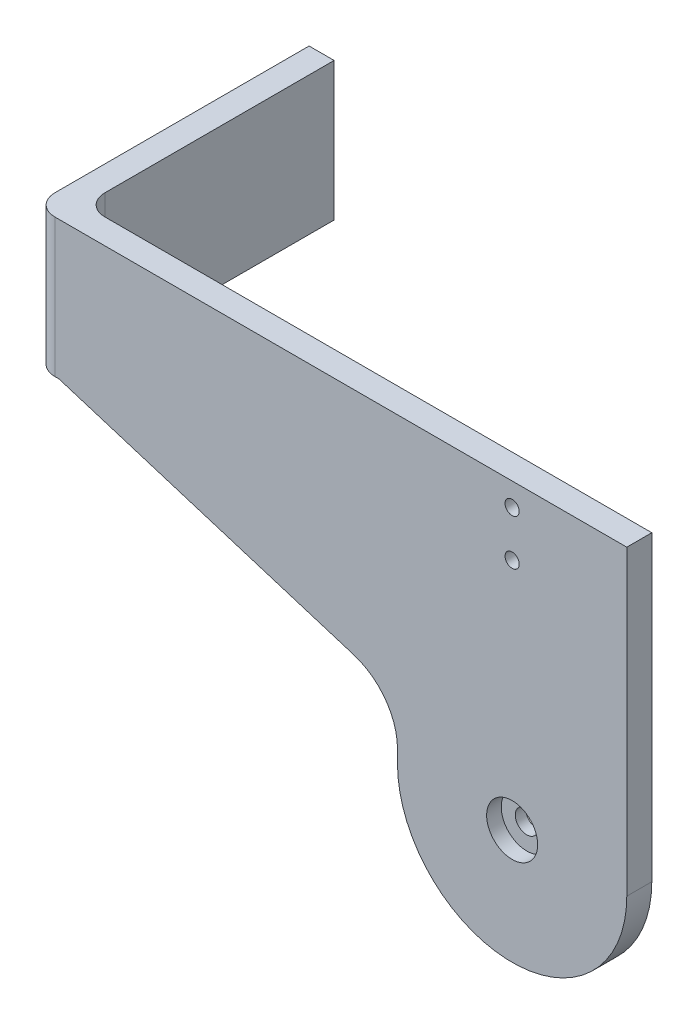
ISO-10303-21;
HEADER;
FILE_DESCRIPTION(('STEP AP214'),'2;1');
FILE_NAME('part.step','',(''),(''),'','','');
FILE_SCHEMA(('AUTOMOTIVE_DESIGN { 1 0 10303 214 1 1 1 1 }'));
ENDSEC;
DATA;
#1=APPLICATION_CONTEXT('core data for automotive mechanical design processes');
#2=APPLICATION_PROTOCOL_DEFINITION('international standard','automotive_design',2000,#1);
#3=PRODUCT_CONTEXT('',#1,'mechanical');
#4=PRODUCT('Part','Part','',(#3));
#5=PRODUCT_RELATED_PRODUCT_CATEGORY('part','',(#4));
#6=PRODUCT_DEFINITION_FORMATION('','',#4);
#7=PRODUCT_DEFINITION_CONTEXT('part definition',#1,'design');
#8=PRODUCT_DEFINITION('design','',#6,#7);
#9=PRODUCT_DEFINITION_SHAPE('','',#8);
#10=(LENGTH_UNIT() NAMED_UNIT(*) SI_UNIT(.MILLI.,.METRE.));
#11=(NAMED_UNIT(*) PLANE_ANGLE_UNIT() SI_UNIT($,.RADIAN.));
#12=(NAMED_UNIT(*) SI_UNIT($,.STERADIAN.) SOLID_ANGLE_UNIT());
#13=UNCERTAINTY_MEASURE_WITH_UNIT(LENGTH_MEASURE(1.E-05),#10,'distance_accuracy_value','');
#14=(GEOMETRIC_REPRESENTATION_CONTEXT(3) GLOBAL_UNCERTAINTY_ASSIGNED_CONTEXT((#13)) GLOBAL_UNIT_ASSIGNED_CONTEXT((#10,
#11,#12)) REPRESENTATION_CONTEXT('',''));
#15=CARTESIAN_POINT('',(0.,0.,0.));
#16=DIRECTION('',(0.,0.,1.));
#17=DIRECTION('',(1.,0.,0.));
#18=AXIS2_PLACEMENT_3D('',#15,#16,#17);
#19=CARTESIAN_POINT('',(-103.7,0.,-5.));
#20=DIRECTION('',(0.,-1.,0.));
#21=DIRECTION('',(0.,0.,-1.));
#22=AXIS2_PLACEMENT_3D('',#19,#20,#21);
#23=CYLINDRICAL_SURFACE('',#22,5.);
#24=DIRECTION('',(0.,1.,0.));
#25=VECTOR('',#24,1.);
#26=CARTESIAN_POINT('',(-103.7,0.,0.));
#27=LINE('',#26,#25);
#28=CARTESIAN_POINT('',(-103.7,37.7951910226967,0.));
#29=VERTEX_POINT('',#28);
#30=CARTESIAN_POINT('',(-103.7,72.5,0.));
#31=VERTEX_POINT('',#30);
#32=EDGE_CURVE('E212',#29,#31,#27,.T.);
#33=ORIENTED_EDGE('',*,*,#32,.F.);
#34=CARTESIAN_POINT('',(-103.7,37.7951910226967,-5.));
#35=DIRECTION('',(0.296450533397002,0.955048208861015,0.));
#36=DIRECTION('',(0.955048208861015,-0.296450533397003,0.));
#37=AXIS2_PLACEMENT_3D('',#34,#35,#36);
#38=ELLIPSE('',#37,5.2353378118608,5.);
#39=CARTESIAN_POINT('',(-108.7,39.3472097095363,-5.));
#40=VERTEX_POINT('',#39);
#41=EDGE_CURVE('E217',#29,#40,#38,.F.);
#42=ORIENTED_EDGE('',*,*,#41,.T.);
#43=DIRECTION('',(0.,1.,0.));
#44=VECTOR('',#43,1.);
#45=CARTESIAN_POINT('',(-108.7,0.,-5.));
#46=LINE('',#45,#44);
#47=CARTESIAN_POINT('',(-108.7,72.5,-5.));
#48=VERTEX_POINT('',#47);
#49=EDGE_CURVE('E215',#48,#40,#46,.F.);
#50=ORIENTED_EDGE('',*,*,#49,.F.);
#51=CARTESIAN_POINT('',(-103.7,72.5,-5.));
#52=DIRECTION('',(0.,-1.,0.));
#53=DIRECTION('',(1.,0.,0.));
#54=AXIS2_PLACEMENT_3D('',#51,#52,#53);
#55=CIRCLE('',#54,5.);
#56=EDGE_CURVE('E126',#48,#31,#55,.F.);
#57=ORIENTED_EDGE('',*,*,#56,.T.);
#58=EDGE_LOOP('',(#33,#42,#50,#57));
#59=FACE_BOUND('',#58,.T.);
#60=ADVANCED_FACE('F36',(#59),#23,.F.);
#61=CARTESIAN_POINT('',(-42.5,3.09246886019721,0.));
#62=DIRECTION('',(0.,0.,-1.));
#63=DIRECTION('',(-1.,0.,0.));
#64=AXIS2_PLACEMENT_3D('',#61,#62,#63);
#65=CYLINDRICAL_SURFACE('',#64,15.);
#66=DIRECTION('',(0.,0.,1.));
#67=VECTOR('',#66,1.);
#68=CARTESIAN_POINT('',(-38.053241999045,17.4181919931124,0.));
#69=LINE('',#68,#67);
#70=CARTESIAN_POINT('',(-38.053241999045,17.4181919931124,0.));
#71=VERTEX_POINT('',#70);
#72=CARTESIAN_POINT('',(-38.053241999045,17.4181919931124,6.));
#73=VERTEX_POINT('',#72);
#74=EDGE_CURVE('E202',#71,#73,#69,.T.);
#75=ORIENTED_EDGE('',*,*,#74,.F.);
#76=CARTESIAN_POINT('',(-42.5,3.09246886019721,0.));
#77=DIRECTION('',(0.,0.,1.));
#78=DIRECTION('',(1.,0.,0.));
#79=AXIS2_PLACEMENT_3D('',#76,#77,#78);
#80=CIRCLE('',#79,15.);
#81=CARTESIAN_POINT('',(-27.5,3.09246886019721,0.));
#82=VERTEX_POINT('',#81);
#83=EDGE_CURVE('E208',#71,#82,#80,.F.);
#84=ORIENTED_EDGE('',*,*,#83,.T.);
#85=DIRECTION('',(0.,0.,1.));
#86=VECTOR('',#85,1.);
#87=CARTESIAN_POINT('',(-27.5,3.09246886019721,0.));
#88=LINE('',#87,#86);
#89=CARTESIAN_POINT('',(-27.5,3.09246886019721,6.));
#90=VERTEX_POINT('',#89);
#91=EDGE_CURVE('E205',#90,#82,#88,.F.);
#92=ORIENTED_EDGE('',*,*,#91,.F.);
#93=CARTESIAN_POINT('',(-42.5,3.09246886019721,6.));
#94=DIRECTION('',(0.,0.,1.));
#95=DIRECTION('',(1.,0.,0.));
#96=AXIS2_PLACEMENT_3D('',#93,#94,#95);
#97=CIRCLE('',#96,15.);
#98=EDGE_CURVE('E210',#90,#73,#97,.T.);
#99=ORIENTED_EDGE('',*,*,#98,.T.);
#100=EDGE_LOOP('',(#75,#84,#92,#99));
#101=FACE_BOUND('',#100,.T.);
#102=ADVANCED_FACE('F245',(#101),#65,.F.);
#103=CARTESIAN_POINT('',(0.,0.,6.));
#104=DIRECTION('',(0.,0.,-1.));
#105=DIRECTION('',(-1.,0.,0.));
#106=AXIS2_PLACEMENT_3D('',#103,#104,#105);
#107=CYLINDRICAL_SURFACE('',#106,27.5);
#108=CARTESIAN_POINT('',(0.,0.,0.));
#109=DIRECTION('',(0.,0.,1.));
#110=DIRECTION('',(1.,0.,0.));
#111=AXIS2_PLACEMENT_3D('',#108,#109,#110);
#112=CIRCLE('',#111,27.5);
#113=CARTESIAN_POINT('',(-27.5,0.,0.));
#114=VERTEX_POINT('',#113);
#115=CARTESIAN_POINT('',(27.5,0.,0.));
#116=VERTEX_POINT('',#115);
#117=EDGE_CURVE('E185',#114,#116,#112,.T.);
#118=ORIENTED_EDGE('',*,*,#117,.T.);
#119=DIRECTION('',(0.,0.,-1.));
#120=VECTOR('',#119,1.);
#121=CARTESIAN_POINT('',(27.5,0.,6.));
#122=LINE('',#121,#120);
#123=CARTESIAN_POINT('',(27.5,0.,6.));
#124=VERTEX_POINT('',#123);
#125=EDGE_CURVE('E199',#124,#116,#122,.T.);
#126=ORIENTED_EDGE('',*,*,#125,.F.);
#127=CARTESIAN_POINT('',(0.,0.,6.));
#128=DIRECTION('',(0.,0.,1.));
#129=DIRECTION('',(1.,0.,0.));
#130=AXIS2_PLACEMENT_3D('',#127,#128,#129);
#131=CIRCLE('',#130,27.5);
#132=CARTESIAN_POINT('',(-27.5,0.,6.));
#133=VERTEX_POINT('',#132);
#134=EDGE_CURVE('E186',#133,#124,#131,.T.);
#135=ORIENTED_EDGE('',*,*,#134,.F.);
#136=DIRECTION('',(0.,0.,-1.));
#137=VECTOR('',#136,1.);
#138=CARTESIAN_POINT('',(-27.5,0.,6.));
#139=LINE('',#138,#137);
#140=EDGE_CURVE('E192',#133,#114,#139,.T.);
#141=ORIENTED_EDGE('',*,*,#140,.T.);
#142=EDGE_LOOP('',(#118,#126,#135,#141));
#143=FACE_BOUND('',#142,.T.);
#144=ADVANCED_FACE('F250',(#143),#107,.T.);
#145=CARTESIAN_POINT('',(27.5,0.,6.));
#146=DIRECTION('',(-1.,0.,0.));
#147=DIRECTION('',(0.,0.,1.));
#148=AXIS2_PLACEMENT_3D('',#145,#146,#147);
#149=PLANE('',#148);
#150=DIRECTION('',(0.,1.,0.));
#151=VECTOR('',#150,1.);
#152=CARTESIAN_POINT('',(27.5,0.,0.));
#153=LINE('',#152,#151);
#154=CARTESIAN_POINT('',(27.5,72.5,0.));
#155=VERTEX_POINT('',#154);
#156=EDGE_CURVE('E190',#116,#155,#153,.T.);
#157=ORIENTED_EDGE('',*,*,#156,.T.);
#158=DIRECTION('',(0.,0.,-1.));
#159=VECTOR('',#158,1.);
#160=CARTESIAN_POINT('',(27.5,72.5,6.));
#161=LINE('',#160,#159);
#162=CARTESIAN_POINT('',(27.5,72.5,6.));
#163=VERTEX_POINT('',#162);
#164=EDGE_CURVE('E181',#163,#155,#161,.T.);
#165=ORIENTED_EDGE('',*,*,#164,.F.);
#166=DIRECTION('',(0.,1.,0.));
#167=VECTOR('',#166,1.);
#168=CARTESIAN_POINT('',(27.5,0.,6.));
#169=LINE('',#168,#167);
#170=EDGE_CURVE('E189',#124,#163,#169,.T.);
#171=ORIENTED_EDGE('',*,*,#170,.F.);
#172=ORIENTED_EDGE('',*,*,#125,.T.);
#173=EDGE_LOOP('',(#157,#165,#171,#172));
#174=FACE_BOUND('',#173,.T.);
#175=ADVANCED_FACE('F254',(#174),#149,.F.);
#176=CARTESIAN_POINT('',(0.,0.,6.));
#177=DIRECTION('',(0.,0.,1.));
#178=DIRECTION('',(1.,0.,0.));
#179=AXIS2_PLACEMENT_3D('',#176,#177,#178);
#180=PLANE('',#179);
#181=CARTESIAN_POINT('',(0.,0.,6.));
#182=DIRECTION('',(0.,0.,1.));
#183=DIRECTION('',(1.,0.,0.));
#184=AXIS2_PLACEMENT_3D('',#181,#182,#183);
#185=CIRCLE('',#184,6.119);
#186=CARTESIAN_POINT('',(6.119,0.,6.));
#187=VERTEX_POINT('',#186);
#188=EDGE_CURVE('E499',#187,#187,#185,.T.);
#189=ORIENTED_EDGE('',*,*,#188,.F.);
#190=EDGE_LOOP('',(#189));
#191=FACE_BOUND('',#190,.T.);
#192=CARTESIAN_POINT('',(0.,67.,6.));
#193=DIRECTION('',(0.,0.,-1.));
#194=DIRECTION('',(-1.,0.,0.));
#195=AXIS2_PLACEMENT_3D('',#192,#193,#194);
#196=CIRCLE('',#195,1.7);
#197=CARTESIAN_POINT('',(-1.7,67.,6.));
#198=VERTEX_POINT('',#197);
#199=EDGE_CURVE('E518',#198,#198,#196,.T.);
#200=ORIENTED_EDGE('',*,*,#199,.T.);
#201=EDGE_LOOP('',(#200));
#202=FACE_BOUND('',#201,.T.);
#203=CARTESIAN_POINT('',(0.,56.05,6.));
#204=DIRECTION('',(0.,0.,-1.));
#205=DIRECTION('',(-1.,0.,0.));
#206=AXIS2_PLACEMENT_3D('',#203,#204,#205);
#207=CIRCLE('',#206,1.7);
#208=CARTESIAN_POINT('',(-1.7,56.05,6.));
#209=VERTEX_POINT('',#208);
#210=EDGE_CURVE('E147',#209,#209,#207,.T.);
#211=ORIENTED_EDGE('',*,*,#210,.T.);
#212=EDGE_LOOP('',(#211));
#213=FACE_BOUND('',#212,.T.);
#214=DIRECTION('',(-1.,0.,0.));
#215=VECTOR('',#214,1.);
#216=CARTESIAN_POINT('',(27.5,72.5,6.));
#217=LINE('',#216,#215);
#218=CARTESIAN_POINT('',(-109.7,72.5,6.));
#219=VERTEX_POINT('',#218);
#220=EDGE_CURVE('E178',#163,#219,#217,.T.);
#221=ORIENTED_EDGE('',*,*,#220,.T.);
#222=DIRECTION('',(0.,-1.,0.));
#223=VECTOR('',#222,1.);
#224=CARTESIAN_POINT('',(-109.7,39.3472097095363,6.));
#225=LINE('',#224,#223);
#226=CARTESIAN_POINT('',(-109.7,39.3472097095363,6.));
#227=VERTEX_POINT('',#226);
#228=EDGE_CURVE('E221',#219,#227,#225,.T.);
#229=ORIENTED_EDGE('',*,*,#228,.T.);
#230=DIRECTION('',(1.,0.,0.));
#231=VECTOR('',#230,1.);
#232=CARTESIAN_POINT('',(-108.7,39.3472097095363,6.));
#233=LINE('',#232,#231);
#234=CARTESIAN_POINT('',(-108.7,39.3472097095363,6.));
#235=VERTEX_POINT('',#234);
#236=EDGE_CURVE('E157',#227,#235,#233,.T.);
#237=ORIENTED_EDGE('',*,*,#236,.T.);
#238=DIRECTION('',(-0.955048208861015,0.296450533397002,0.));
#239=VECTOR('',#238,1.);
#240=CARTESIAN_POINT('',(-108.7,39.3472097095363,6.));
#241=LINE('',#240,#239);
#242=EDGE_CURVE('E131',#73,#235,#241,.T.);
#243=ORIENTED_EDGE('',*,*,#242,.F.);
#244=ORIENTED_EDGE('',*,*,#98,.F.);
#245=DIRECTION('',(0.,1.,0.));
#246=VECTOR('',#245,1.);
#247=CARTESIAN_POINT('',(-27.5,14.1424262352607,6.));
#248=LINE('',#247,#246);
#249=EDGE_CURVE('E167',#133,#90,#248,.T.);
#250=ORIENTED_EDGE('',*,*,#249,.F.);
#251=ORIENTED_EDGE('',*,*,#134,.T.);
#252=ORIENTED_EDGE('',*,*,#170,.T.);
#253=EDGE_LOOP('',(#221,#229,#237,#243,#244,#250,#251,#252));
#254=FACE_BOUND('',#253,.T.);
#255=ADVANCED_FACE('F227',(#191,#202,#213,#254),#180,.T.);
#256=CARTESIAN_POINT('',(0.,0.,0.));
#257=DIRECTION('',(0.,0.,1.));
#258=DIRECTION('',(1.,0.,0.));
#259=AXIS2_PLACEMENT_3D('',#256,#257,#258);
#260=PLANE('',#259);
#261=CARTESIAN_POINT('',(0.,0.,0.));
#262=DIRECTION('',(0.,0.,1.));
#263=DIRECTION('',(1.,0.,0.));
#264=AXIS2_PLACEMENT_3D('',#261,#262,#263);
#265=CIRCLE('',#264,2.74999999999999);
#266=CARTESIAN_POINT('',(2.74999999999999,0.,0.));
#267=VERTEX_POINT('',#266);
#268=EDGE_CURVE('E40',#267,#267,#265,.T.);
#269=ORIENTED_EDGE('',*,*,#268,.T.);
#270=EDGE_LOOP('',(#269));
#271=FACE_BOUND('',#270,.T.);
#272=CARTESIAN_POINT('',(0.,67.,0.));
#273=DIRECTION('',(0.,0.,-1.));
#274=DIRECTION('',(-1.,0.,0.));
#275=AXIS2_PLACEMENT_3D('',#272,#273,#274);
#276=CIRCLE('',#275,4.525);
#277=CARTESIAN_POINT('',(-4.525,67.,0.));
#278=VERTEX_POINT('',#277);
#279=EDGE_CURVE('E506',#278,#278,#276,.T.);
#280=ORIENTED_EDGE('',*,*,#279,.F.);
#281=EDGE_LOOP('',(#280));
#282=FACE_BOUND('',#281,.T.);
#283=CARTESIAN_POINT('',(0.,56.05,0.));
#284=DIRECTION('',(0.,0.,-1.));
#285=DIRECTION('',(-1.,0.,0.));
#286=AXIS2_PLACEMENT_3D('',#283,#284,#285);
#287=CIRCLE('',#286,4.525);
#288=CARTESIAN_POINT('',(-4.525,56.05,0.));
#289=VERTEX_POINT('',#288);
#290=EDGE_CURVE('E521',#289,#289,#287,.T.);
#291=ORIENTED_EDGE('',*,*,#290,.F.);
#292=EDGE_LOOP('',(#291));
#293=FACE_BOUND('',#292,.T.);
#294=DIRECTION('',(-0.955048208861015,0.296450533397002,0.));
#295=VECTOR('',#294,1.);
#296=CARTESIAN_POINT('',(-108.7,39.3472097095363,0.));
#297=LINE('',#296,#295);
#298=EDGE_CURVE('E163',#71,#29,#297,.T.);
#299=ORIENTED_EDGE('',*,*,#298,.T.);
#300=ORIENTED_EDGE('',*,*,#32,.T.);
#301=DIRECTION('',(-1.,0.,0.));
#302=VECTOR('',#301,1.);
#303=CARTESIAN_POINT('',(27.5,72.5,0.));
#304=LINE('',#303,#302);
#305=EDGE_CURVE('E177',#155,#31,#304,.T.);
#306=ORIENTED_EDGE('',*,*,#305,.F.);
#307=ORIENTED_EDGE('',*,*,#156,.F.);
#308=ORIENTED_EDGE('',*,*,#117,.F.);
#309=DIRECTION('',(0.,1.,0.));
#310=VECTOR('',#309,1.);
#311=CARTESIAN_POINT('',(-27.5,14.1424262352607,0.));
#312=LINE('',#311,#310);
#313=EDGE_CURVE('E166',#114,#82,#312,.T.);
#314=ORIENTED_EDGE('',*,*,#313,.T.);
#315=ORIENTED_EDGE('',*,*,#83,.F.);
#316=EDGE_LOOP('',(#299,#300,#306,#307,#308,#314,#315));
#317=FACE_BOUND('',#316,.T.);
#318=ADVANCED_FACE('F239',(#271,#282,#293,#317),#260,.F.);
#319=CARTESIAN_POINT('',(27.5,72.5,6.));
#320=DIRECTION('',(0.,-1.,0.));
#321=DIRECTION('',(1.,0.,0.));
#322=AXIS2_PLACEMENT_3D('',#319,#320,#321);
#323=PLANE('',#322);
#324=DIRECTION('',(0.,0.,-1.));
#325=VECTOR('',#324,1.);
#326=CARTESIAN_POINT('',(-114.7,72.5,6.));
#327=LINE('',#326,#325);
#328=CARTESIAN_POINT('',(-114.7,72.5,1.));
#329=VERTEX_POINT('',#328);
#330=CARTESIAN_POINT('',(-114.7,72.5,-60.));
#331=VERTEX_POINT('',#330);
#332=EDGE_CURVE('E132',#329,#331,#327,.T.);
#333=ORIENTED_EDGE('',*,*,#332,.F.);
#334=CARTESIAN_POINT('',(-109.7,72.5,1.));
#335=DIRECTION('',(0.,-1.,0.));
#336=DIRECTION('',(1.,0.,0.));
#337=AXIS2_PLACEMENT_3D('',#334,#335,#336);
#338=CIRCLE('',#337,5.);
#339=EDGE_CURVE('E11',#329,#219,#338,.F.);
#340=ORIENTED_EDGE('',*,*,#339,.T.);
#341=ORIENTED_EDGE('',*,*,#220,.F.);
#342=ORIENTED_EDGE('',*,*,#164,.T.);
#343=ORIENTED_EDGE('',*,*,#305,.T.);
#344=ORIENTED_EDGE('',*,*,#56,.F.);
#345=DIRECTION('',(0.,0.,-1.));
#346=VECTOR('',#345,1.);
#347=CARTESIAN_POINT('',(-108.7,72.5,6.));
#348=LINE('',#347,#346);
#349=CARTESIAN_POINT('',(-108.7,72.5,-60.));
#350=VERTEX_POINT('',#349);
#351=EDGE_CURVE('E121',#48,#350,#348,.T.);
#352=ORIENTED_EDGE('',*,*,#351,.T.);
#353=DIRECTION('',(-1.,0.,0.));
#354=VECTOR('',#353,1.);
#355=CARTESIAN_POINT('',(-114.7,72.5,-60.));
#356=LINE('',#355,#354);
#357=EDGE_CURVE('E124',#350,#331,#356,.T.);
#358=ORIENTED_EDGE('',*,*,#357,.T.);
#359=EDGE_LOOP('',(#333,#340,#341,#342,#343,#344,#352,#358));
#360=FACE_BOUND('',#359,.T.);
#361=ADVANCED_FACE('F123',(#360),#323,.F.);
#362=CARTESIAN_POINT('',(-108.7,39.3472097095363,0.));
#363=DIRECTION('',(0.296450533397002,0.955048208861015,0.));
#364=DIRECTION('',(-0.955048208861015,0.296450533397003,0.));
#365=AXIS2_PLACEMENT_3D('',#362,#363,#364);
#366=PLANE('',#365);
#367=ORIENTED_EDGE('',*,*,#298,.F.);
#368=ORIENTED_EDGE('',*,*,#74,.T.);
#369=ORIENTED_EDGE('',*,*,#242,.T.);
#370=DIRECTION('',(0.,0.,1.));
#371=VECTOR('',#370,1.);
#372=CARTESIAN_POINT('',(-108.7,39.3472097095363,0.));
#373=LINE('',#372,#371);
#374=EDGE_CURVE('E170',#40,#235,#373,.T.);
#375=ORIENTED_EDGE('',*,*,#374,.F.);
#376=ORIENTED_EDGE('',*,*,#41,.F.);
#377=EDGE_LOOP('',(#367,#368,#369,#375,#376));
#378=FACE_BOUND('',#377,.T.);
#379=ADVANCED_FACE('F235',(#378),#366,.F.);
#380=CARTESIAN_POINT('',(-27.5,14.1424262352607,0.));
#381=DIRECTION('',(1.,0.,0.));
#382=DIRECTION('',(0.,1.,0.));
#383=AXIS2_PLACEMENT_3D('',#380,#381,#382);
#384=PLANE('',#383);
#385=ORIENTED_EDGE('',*,*,#249,.T.);
#386=ORIENTED_EDGE('',*,*,#91,.T.);
#387=ORIENTED_EDGE('',*,*,#313,.F.);
#388=ORIENTED_EDGE('',*,*,#140,.F.);
#389=EDGE_LOOP('',(#385,#386,#387,#388));
#390=FACE_BOUND('',#389,.T.);
#391=ADVANCED_FACE('F247',(#390),#384,.F.);
#392=CARTESIAN_POINT('',(-108.7,72.5,6.));
#393=DIRECTION('',(-1.,0.,0.));
#394=DIRECTION('',(0.,0.,1.));
#395=AXIS2_PLACEMENT_3D('',#392,#393,#394);
#396=PLANE('',#395);
#397=ORIENTED_EDGE('',*,*,#351,.F.);
#398=ORIENTED_EDGE('',*,*,#49,.T.);
#399=DIRECTION('',(0.,0.,-1.));
#400=VECTOR('',#399,1.);
#401=CARTESIAN_POINT('',(-108.7,39.3472097095363,6.));
#402=LINE('',#401,#400);
#403=CARTESIAN_POINT('',(-108.7,39.3472097095363,-60.));
#404=VERTEX_POINT('',#403);
#405=EDGE_CURVE('E146',#40,#404,#402,.T.);
#406=ORIENTED_EDGE('',*,*,#405,.T.);
#407=DIRECTION('',(0.,1.,0.));
#408=VECTOR('',#407,1.);
#409=CARTESIAN_POINT('',(-108.7,72.5,-60.));
#410=LINE('',#409,#408);
#411=EDGE_CURVE('E139',#404,#350,#410,.T.);
#412=ORIENTED_EDGE('',*,*,#411,.T.);
#413=EDGE_LOOP('',(#397,#398,#406,#412));
#414=FACE_BOUND('',#413,.T.);
#415=ADVANCED_FACE('F144',(#414),#396,.F.);
#416=CARTESIAN_POINT('',(-114.7,39.3472097095363,6.));
#417=DIRECTION('',(1.,0.,0.));
#418=DIRECTION('',(0.,0.,-1.));
#419=AXIS2_PLACEMENT_3D('',#416,#417,#418);
#420=PLANE('',#419);
#421=DIRECTION('',(0.,0.,-1.));
#422=VECTOR('',#421,1.);
#423=CARTESIAN_POINT('',(-114.7,39.3472097095363,6.));
#424=LINE('',#423,#422);
#425=CARTESIAN_POINT('',(-114.7,39.3472097095363,1.));
#426=VERTEX_POINT('',#425);
#427=CARTESIAN_POINT('',(-114.7,39.3472097095363,-60.));
#428=VERTEX_POINT('',#427);
#429=EDGE_CURVE('E160',#426,#428,#424,.T.);
#430=ORIENTED_EDGE('',*,*,#429,.F.);
#431=DIRECTION('',(0.,-1.,0.));
#432=VECTOR('',#431,1.);
#433=CARTESIAN_POINT('',(-114.7,72.5,1.));
#434=LINE('',#433,#432);
#435=EDGE_CURVE('E45',#426,#329,#434,.F.);
#436=ORIENTED_EDGE('',*,*,#435,.T.);
#437=ORIENTED_EDGE('',*,*,#332,.T.);
#438=DIRECTION('',(0.,-1.,0.));
#439=VECTOR('',#438,1.);
#440=CARTESIAN_POINT('',(-114.7,39.3472097095363,-60.));
#441=LINE('',#440,#439);
#442=EDGE_CURVE('E142',#331,#428,#441,.T.);
#443=ORIENTED_EDGE('',*,*,#442,.T.);
#444=EDGE_LOOP('',(#430,#436,#437,#443));
#445=FACE_BOUND('',#444,.T.);
#446=ADVANCED_FACE('F472',(#445),#420,.F.);
#447=CARTESIAN_POINT('',(-108.7,39.3472097095363,6.));
#448=DIRECTION('',(0.,1.,0.));
#449=DIRECTION('',(0.,0.,1.));
#450=AXIS2_PLACEMENT_3D('',#447,#448,#449);
#451=PLANE('',#450);
#452=ORIENTED_EDGE('',*,*,#236,.F.);
#453=CARTESIAN_POINT('',(-109.7,39.3472097095363,1.));
#454=DIRECTION('',(0.,1.,0.));
#455=DIRECTION('',(0.,0.,1.));
#456=AXIS2_PLACEMENT_3D('',#453,#454,#455);
#457=CIRCLE('',#456,5.);
#458=EDGE_CURVE('E59',#227,#426,#457,.F.);
#459=ORIENTED_EDGE('',*,*,#458,.T.);
#460=ORIENTED_EDGE('',*,*,#429,.T.);
#461=DIRECTION('',(1.,0.,0.));
#462=VECTOR('',#461,1.);
#463=CARTESIAN_POINT('',(-108.7,39.3472097095363,-60.));
#464=LINE('',#463,#462);
#465=EDGE_CURVE('E155',#428,#404,#464,.T.);
#466=ORIENTED_EDGE('',*,*,#465,.T.);
#467=ORIENTED_EDGE('',*,*,#405,.F.);
#468=ORIENTED_EDGE('',*,*,#374,.T.);
#469=EDGE_LOOP('',(#452,#459,#460,#466,#467,#468));
#470=FACE_BOUND('',#469,.T.);
#471=ADVANCED_FACE('F232',(#470),#451,.F.);
#472=CARTESIAN_POINT('',(0.,0.,-60.));
#473=DIRECTION('',(0.,0.,-1.));
#474=DIRECTION('',(-1.,0.,0.));
#475=AXIS2_PLACEMENT_3D('',#472,#473,#474);
#476=PLANE('',#475);
#477=ORIENTED_EDGE('',*,*,#411,.F.);
#478=ORIENTED_EDGE('',*,*,#465,.F.);
#479=ORIENTED_EDGE('',*,*,#442,.F.);
#480=ORIENTED_EDGE('',*,*,#357,.F.);
#481=EDGE_LOOP('',(#477,#478,#479,#480));
#482=FACE_BOUND('',#481,.T.);
#483=ADVANCED_FACE('F137',(#482),#476,.T.);
#484=CARTESIAN_POINT('',(-109.7,0.,1.));
#485=DIRECTION('',(0.,1.,0.));
#486=DIRECTION('',(0.,0.,1.));
#487=AXIS2_PLACEMENT_3D('',#484,#485,#486);
#488=CYLINDRICAL_SURFACE('',#487,5.);
#489=ORIENTED_EDGE('',*,*,#339,.F.);
#490=ORIENTED_EDGE('',*,*,#435,.F.);
#491=ORIENTED_EDGE('',*,*,#458,.F.);
#492=ORIENTED_EDGE('',*,*,#228,.F.);
#493=EDGE_LOOP('',(#489,#490,#491,#492));
#494=FACE_BOUND('',#493,.T.);
#495=ADVANCED_FACE('F38',(#494),#488,.T.);
#496=CARTESIAN_POINT('',(0.,56.05,0.));
#497=DIRECTION('',(0.,0.,-1.));
#498=DIRECTION('',(-1.,0.,0.));
#499=AXIS2_PLACEMENT_3D('',#496,#497,#498);
#500=CYLINDRICAL_SURFACE('',#499,1.7);
#501=ORIENTED_EDGE('',*,*,#210,.F.);
#502=EDGE_LOOP('',(#501));
#503=FACE_BOUND('',#502,.T.);
#504=CARTESIAN_POINT('',(0.,56.05,0.5));
#505=DIRECTION('',(0.,0.,-1.));
#506=DIRECTION('',(-1.,0.,0.));
#507=AXIS2_PLACEMENT_3D('',#504,#505,#506);
#508=CIRCLE('',#507,1.7);
#509=CARTESIAN_POINT('',(-1.7,56.05,0.5));
#510=VERTEX_POINT('',#509);
#511=EDGE_CURVE('E150',#510,#510,#508,.T.);
#512=ORIENTED_EDGE('',*,*,#511,.T.);
#513=EDGE_LOOP('',(#512));
#514=FACE_BOUND('',#513,.T.);
#515=ADVANCED_FACE('F357',(#503,#514),#500,.F.);
#516=CARTESIAN_POINT('',(4.5,56.05,0.5));
#517=DIRECTION('',(0.,0.,1.));
#518=DIRECTION('',(1.,0.,0.));
#519=AXIS2_PLACEMENT_3D('',#516,#517,#518);
#520=PLANE('',#519);
#521=ORIENTED_EDGE('',*,*,#511,.F.);
#522=EDGE_LOOP('',(#521));
#523=FACE_BOUND('',#522,.T.);
#524=CARTESIAN_POINT('',(0.,56.05,0.5));
#525=DIRECTION('',(0.,0.,-1.));
#526=DIRECTION('',(-1.,0.,0.));
#527=AXIS2_PLACEMENT_3D('',#524,#525,#526);
#528=CIRCLE('',#527,4.5);
#529=CARTESIAN_POINT('',(-4.5,56.05,0.5));
#530=VERTEX_POINT('',#529);
#531=EDGE_CURVE('E527',#530,#530,#528,.T.);
#532=ORIENTED_EDGE('',*,*,#531,.T.);
#533=EDGE_LOOP('',(#532));
#534=FACE_BOUND('',#533,.T.);
#535=ADVANCED_FACE('F365',(#523,#534),#520,.F.);
#536=CARTESIAN_POINT('',(0.,56.05,0.));
#537=DIRECTION('',(0.,0.,-1.));
#538=DIRECTION('',(-1.,0.,0.));
#539=AXIS2_PLACEMENT_3D('',#536,#537,#538);
#540=CYLINDRICAL_SURFACE('',#539,4.5);
#541=ORIENTED_EDGE('',*,*,#531,.F.);
#542=EDGE_LOOP('',(#541));
#543=FACE_BOUND('',#542,.T.);
#544=CARTESIAN_POINT('',(0.,56.05,0.025));
#545=DIRECTION('',(0.,0.,-1.));
#546=DIRECTION('',(-1.,0.,0.));
#547=AXIS2_PLACEMENT_3D('',#544,#545,#546);
#548=CIRCLE('',#547,4.5);
#549=CARTESIAN_POINT('',(-4.5,56.05,0.025));
#550=VERTEX_POINT('',#549);
#551=EDGE_CURVE('E524',#550,#550,#548,.T.);
#552=ORIENTED_EDGE('',*,*,#551,.T.);
#553=EDGE_LOOP('',(#552));
#554=FACE_BOUND('',#553,.T.);
#555=ADVANCED_FACE('F374',(#543,#554),#540,.F.);
#556=CARTESIAN_POINT('',(0.,56.05,0.));
#557=DIRECTION('',(0.,0.,-1.));
#558=DIRECTION('',(-1.,0.,0.));
#559=AXIS2_PLACEMENT_3D('',#556,#557,#558);
#560=CONICAL_SURFACE('',#559,4.525,0.785398163397411);
#561=ORIENTED_EDGE('',*,*,#551,.F.);
#562=EDGE_LOOP('',(#561));
#563=FACE_BOUND('',#562,.T.);
#564=ORIENTED_EDGE('',*,*,#290,.T.);
#565=EDGE_LOOP('',(#564));
#566=FACE_BOUND('',#565,.T.);
#567=ADVANCED_FACE('F383',(#563,#566),#560,.F.);
#568=CARTESIAN_POINT('',(0.,67.,0.));
#569=DIRECTION('',(0.,0.,-1.));
#570=DIRECTION('',(-1.,0.,0.));
#571=AXIS2_PLACEMENT_3D('',#568,#569,#570);
#572=CYLINDRICAL_SURFACE('',#571,1.7);
#573=ORIENTED_EDGE('',*,*,#199,.F.);
#574=EDGE_LOOP('',(#573));
#575=FACE_BOUND('',#574,.T.);
#576=CARTESIAN_POINT('',(0.,67.,0.5));
#577=DIRECTION('',(0.,0.,-1.));
#578=DIRECTION('',(-1.,0.,0.));
#579=AXIS2_PLACEMENT_3D('',#576,#577,#578);
#580=CIRCLE('',#579,1.7);
#581=CARTESIAN_POINT('',(-1.7,67.,0.5));
#582=VERTEX_POINT('',#581);
#583=EDGE_CURVE('E515',#582,#582,#580,.T.);
#584=ORIENTED_EDGE('',*,*,#583,.T.);
#585=EDGE_LOOP('',(#584));
#586=FACE_BOUND('',#585,.T.);
#587=ADVANCED_FACE('F392',(#575,#586),#572,.F.);
#588=CARTESIAN_POINT('',(4.5,67.,0.5));
#589=DIRECTION('',(0.,0.,1.));
#590=DIRECTION('',(1.,0.,0.));
#591=AXIS2_PLACEMENT_3D('',#588,#589,#590);
#592=PLANE('',#591);
#593=ORIENTED_EDGE('',*,*,#583,.F.);
#594=EDGE_LOOP('',(#593));
#595=FACE_BOUND('',#594,.T.);
#596=CARTESIAN_POINT('',(0.,67.,0.5));
#597=DIRECTION('',(0.,0.,-1.));
#598=DIRECTION('',(-1.,0.,0.));
#599=AXIS2_PLACEMENT_3D('',#596,#597,#598);
#600=CIRCLE('',#599,4.5);
#601=CARTESIAN_POINT('',(-4.5,67.,0.5));
#602=VERTEX_POINT('',#601);
#603=EDGE_CURVE('E512',#602,#602,#600,.T.);
#604=ORIENTED_EDGE('',*,*,#603,.T.);
#605=EDGE_LOOP('',(#604));
#606=FACE_BOUND('',#605,.T.);
#607=ADVANCED_FACE('F401',(#595,#606),#592,.F.);
#608=CARTESIAN_POINT('',(0.,67.,0.));
#609=DIRECTION('',(0.,0.,-1.));
#610=DIRECTION('',(-1.,0.,0.));
#611=AXIS2_PLACEMENT_3D('',#608,#609,#610);
#612=CYLINDRICAL_SURFACE('',#611,4.5);
#613=ORIENTED_EDGE('',*,*,#603,.F.);
#614=EDGE_LOOP('',(#613));
#615=FACE_BOUND('',#614,.T.);
#616=CARTESIAN_POINT('',(0.,67.,0.025));
#617=DIRECTION('',(0.,0.,-1.));
#618=DIRECTION('',(-1.,0.,0.));
#619=AXIS2_PLACEMENT_3D('',#616,#617,#618);
#620=CIRCLE('',#619,4.5);
#621=CARTESIAN_POINT('',(-4.5,67.,0.025));
#622=VERTEX_POINT('',#621);
#623=EDGE_CURVE('E509',#622,#622,#620,.T.);
#624=ORIENTED_EDGE('',*,*,#623,.T.);
#625=EDGE_LOOP('',(#624));
#626=FACE_BOUND('',#625,.T.);
#627=ADVANCED_FACE('F410',(#615,#626),#612,.F.);
#628=CARTESIAN_POINT('',(0.,67.,0.));
#629=DIRECTION('',(0.,0.,-1.));
#630=DIRECTION('',(-1.,0.,0.));
#631=AXIS2_PLACEMENT_3D('',#628,#629,#630);
#632=CONICAL_SURFACE('',#631,4.525,0.785398163397411);
#633=ORIENTED_EDGE('',*,*,#623,.F.);
#634=EDGE_LOOP('',(#633));
#635=FACE_BOUND('',#634,.T.);
#636=ORIENTED_EDGE('',*,*,#279,.T.);
#637=EDGE_LOOP('',(#636));
#638=FACE_BOUND('',#637,.T.);
#639=ADVANCED_FACE('F419',(#635,#638),#632,.F.);
#640=CARTESIAN_POINT('',(0.,0.,6.));
#641=DIRECTION('',(0.,0.,1.));
#642=DIRECTION('',(1.,0.,0.));
#643=AXIS2_PLACEMENT_3D('',#640,#641,#642);
#644=CYLINDRICAL_SURFACE('',#643,2.74999999999999);
#645=CARTESIAN_POINT('',(0.,0.,2.5));
#646=DIRECTION('',(0.,0.,1.));
#647=DIRECTION('',(1.,0.,0.));
#648=AXIS2_PLACEMENT_3D('',#645,#646,#647);
#649=CIRCLE('',#648,2.75);
#650=CARTESIAN_POINT('',(2.75,0.,2.5));
#651=VERTEX_POINT('',#650);
#652=EDGE_CURVE('E501',#651,#651,#649,.T.);
#653=ORIENTED_EDGE('',*,*,#652,.T.);
#654=EDGE_LOOP('',(#653));
#655=FACE_BOUND('',#654,.T.);
#656=ORIENTED_EDGE('',*,*,#268,.F.);
#657=EDGE_LOOP('',(#656));
#658=FACE_BOUND('',#657,.T.);
#659=ADVANCED_FACE('F428',(#655,#658),#644,.F.);
#660=CARTESIAN_POINT('',(2.75,0.,2.5));
#661=DIRECTION('',(0.,0.,-1.));
#662=DIRECTION('',(-1.,0.,0.));
#663=AXIS2_PLACEMENT_3D('',#660,#661,#662);
#664=PLANE('',#663);
#665=ORIENTED_EDGE('',*,*,#652,.F.);
#666=EDGE_LOOP('',(#665));
#667=FACE_BOUND('',#666,.T.);
#668=CARTESIAN_POINT('',(0.,0.,2.5));
#669=DIRECTION('',(0.,0.,1.));
#670=DIRECTION('',(1.,0.,0.));
#671=AXIS2_PLACEMENT_3D('',#668,#669,#670);
#672=CIRCLE('',#671,6.119);
#673=CARTESIAN_POINT('',(6.119,0.,2.5));
#674=VERTEX_POINT('',#673);
#675=EDGE_CURVE('E496',#674,#674,#672,.T.);
#676=ORIENTED_EDGE('',*,*,#675,.T.);
#677=EDGE_LOOP('',(#676));
#678=FACE_BOUND('',#677,.T.);
#679=ADVANCED_FACE('F436',(#667,#678),#664,.F.);
#680=CARTESIAN_POINT('',(0.,0.,6.));
#681=DIRECTION('',(0.,0.,1.));
#682=DIRECTION('',(1.,0.,0.));
#683=AXIS2_PLACEMENT_3D('',#680,#681,#682);
#684=CYLINDRICAL_SURFACE('',#683,6.119);
#685=ORIENTED_EDGE('',*,*,#675,.F.);
#686=EDGE_LOOP('',(#685));
#687=FACE_BOUND('',#686,.T.);
#688=ORIENTED_EDGE('',*,*,#188,.T.);
#689=EDGE_LOOP('',(#688));
#690=FACE_BOUND('',#689,.T.);
#691=ADVANCED_FACE('F445',(#687,#690),#684,.F.);
#692=CLOSED_SHELL('',(#60,#102,#144,#175,#255,#318,#361,#379,#391,#415,#446,#471,#483,#495,#515,
#535,#555,#567,#587,#607,#627,#639,#659,#679,#691));
#693=MANIFOLD_SOLID_BREP('B2',#692);
#694=ADVANCED_BREP_SHAPE_REPRESENTATION('',(#18,#693),#14);
#695=SHAPE_DEFINITION_REPRESENTATION(#9,#694);
ENDSEC;
END-ISO-10303-21;
